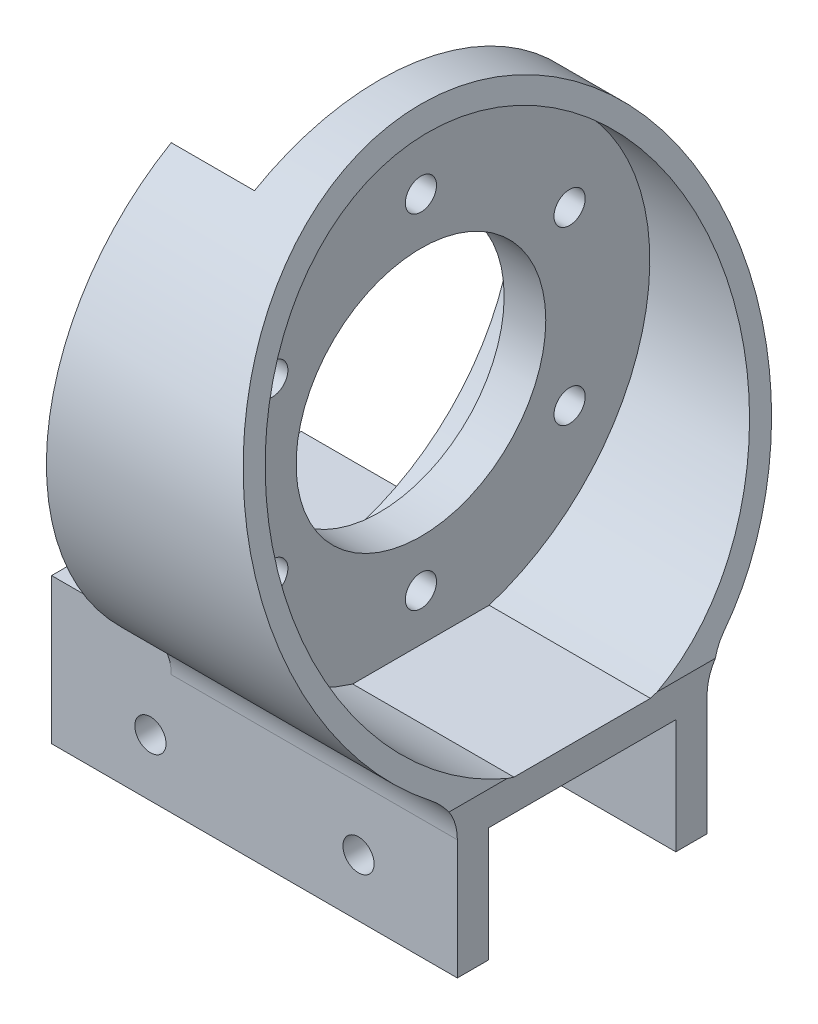
ISO-10303-21;
HEADER;
FILE_DESCRIPTION(('STEP AP214'),'2;1');
FILE_NAME('part.step','',(''),(''),'','','');
FILE_SCHEMA(('AUTOMOTIVE_DESIGN { 1 0 10303 214 1 1 1 1 }'));
ENDSEC;
DATA;
#1=APPLICATION_CONTEXT('core data for automotive mechanical design processes');
#2=APPLICATION_PROTOCOL_DEFINITION('international standard','automotive_design',2000,#1);
#3=PRODUCT_CONTEXT('',#1,'mechanical');
#4=PRODUCT('Part','Part','',(#3));
#5=PRODUCT_RELATED_PRODUCT_CATEGORY('part','',(#4));
#6=PRODUCT_DEFINITION_FORMATION('','',#4);
#7=PRODUCT_DEFINITION_CONTEXT('part definition',#1,'design');
#8=PRODUCT_DEFINITION('design','',#6,#7);
#9=PRODUCT_DEFINITION_SHAPE('','',#8);
#10=(LENGTH_UNIT() NAMED_UNIT(*) SI_UNIT(.MILLI.,.METRE.));
#11=(NAMED_UNIT(*) PLANE_ANGLE_UNIT() SI_UNIT($,.RADIAN.));
#12=(NAMED_UNIT(*) SI_UNIT($,.STERADIAN.) SOLID_ANGLE_UNIT());
#13=UNCERTAINTY_MEASURE_WITH_UNIT(LENGTH_MEASURE(1.E-05),#10,'distance_accuracy_value','');
#14=(GEOMETRIC_REPRESENTATION_CONTEXT(3) GLOBAL_UNCERTAINTY_ASSIGNED_CONTEXT((#13)) GLOBAL_UNIT_ASSIGNED_CONTEXT((#10,
#11,#12)) REPRESENTATION_CONTEXT('',''));
#15=CARTESIAN_POINT('',(0.,0.,0.));
#16=DIRECTION('',(0.,0.,1.));
#17=DIRECTION('',(1.,0.,0.));
#18=AXIS2_PLACEMENT_3D('',#15,#16,#17);
#19=CARTESIAN_POINT('',(16.5,-11.9946802489416,27.));
#20=DIRECTION('',(-1.,0.,0.));
#21=DIRECTION('',(0.,0.,1.));
#22=AXIS2_PLACEMENT_3D('',#19,#20,#21);
#23=CYLINDRICAL_SURFACE('',#22,5.);
#24=CARTESIAN_POINT('',(4.50000000000001,-11.9946802489416,27.));
#25=DIRECTION('',(-1.,0.,0.));
#26=DIRECTION('',(0.,0.,1.));
#27=AXIS2_PLACEMENT_3D('',#24,#25,#26);
#28=CIRCLE('',#27,5.);
#29=CARTESIAN_POINT('',(4.50000000000001,-11.9946802489416,22.));
#30=VERTEX_POINT('',#29);
#31=CARTESIAN_POINT('',(4.50000000000001,-7.94387330946891,24.0689655172414));
#32=VERTEX_POINT('',#31);
#33=EDGE_CURVE('E53',#30,#32,#28,.F.);
#34=ORIENTED_EDGE('',*,*,#33,.F.);
#35=DIRECTION('',(1.,0.,0.));
#36=VECTOR('',#35,1.);
#37=CARTESIAN_POINT('',(4.5,-11.9946802489416,22.));
#38=LINE('',#37,#36);
#39=CARTESIAN_POINT('',(32.,-11.9946802489416,22.));
#40=VERTEX_POINT('',#39);
#41=EDGE_CURVE('E224',#40,#30,#38,.F.);
#42=ORIENTED_EDGE('',*,*,#41,.F.);
#43=CARTESIAN_POINT('',(32.,-11.9946802489416,27.));
#44=DIRECTION('',(1.,0.,0.));
#45=DIRECTION('',(0.,0.,-1.));
#46=AXIS2_PLACEMENT_3D('',#43,#44,#45);
#47=CIRCLE('',#46,5.);
#48=CARTESIAN_POINT('',(32.,-9.28460969082664,22.7981530763201));
#49=VERTEX_POINT('',#48);
#50=EDGE_CURVE('E231',#49,#40,#47,.F.);
#51=ORIENTED_EDGE('',*,*,#50,.F.);
#52=CARTESIAN_POINT('',(32.9379582392428,-11.9946802489416,27.));
#53=DIRECTION('',(-0.945001497744751,-0.327066001382254,0.));
#54=DIRECTION('',(-0.327066001382254,0.945001497744752,0.));
#55=AXIS2_PLACEMENT_3D('',#52,#53,#54);
#56=ELLIPSE('',#55,5.2909969052245,5.);
#57=CARTESIAN_POINT('',(31.5359697437466,-7.94387330946891,24.0689655172414));
#58=VERTEX_POINT('',#57);
#59=EDGE_CURVE('E228',#58,#49,#56,.T.);
#60=ORIENTED_EDGE('',*,*,#59,.F.);
#61=DIRECTION('',(-1.,0.,0.));
#62=VECTOR('',#61,1.);
#63=CARTESIAN_POINT('',(16.5,-7.94387330946891,24.0689655172414));
#64=LINE('',#63,#62);
#65=EDGE_CURVE('E221',#32,#58,#64,.F.);
#66=ORIENTED_EDGE('',*,*,#65,.F.);
#67=EDGE_LOOP('',(#34,#42,#51,#60,#66));
#68=FACE_BOUND('',#67,.T.);
#69=ADVANCED_FACE('F36',(#68),#23,.F.);
#70=CARTESIAN_POINT('',(16.5,-11.9946802489416,-6.99999999999996));
#71=DIRECTION('',(-1.,0.,0.));
#72=DIRECTION('',(0.,0.,1.));
#73=AXIS2_PLACEMENT_3D('',#70,#71,#72);
#74=CYLINDRICAL_SURFACE('',#73,5.);
#75=DIRECTION('',(1.,0.,0.));
#76=VECTOR('',#75,1.);
#77=CARTESIAN_POINT('',(32.,-11.9946802489416,-1.99999999999996));
#78=LINE('',#77,#76);
#79=CARTESIAN_POINT('',(4.50000000000001,-11.9946802489416,-1.99999999999996));
#80=VERTEX_POINT('',#79);
#81=CARTESIAN_POINT('',(32.,-11.9946802489416,-1.99999999999996));
#82=VERTEX_POINT('',#81);
#83=EDGE_CURVE('E226',#80,#82,#78,.T.);
#84=ORIENTED_EDGE('',*,*,#83,.F.);
#85=CARTESIAN_POINT('',(4.50000000000001,-11.9946802489416,-6.99999999999996));
#86=DIRECTION('',(-1.,0.,0.));
#87=DIRECTION('',(0.,0.,1.));
#88=AXIS2_PLACEMENT_3D('',#85,#86,#87);
#89=CIRCLE('',#88,5.);
#90=CARTESIAN_POINT('',(4.50000000000001,-7.94387330946885,-4.06896551724129));
#91=VERTEX_POINT('',#90);
#92=EDGE_CURVE('E234',#91,#80,#89,.F.);
#93=ORIENTED_EDGE('',*,*,#92,.F.);
#94=DIRECTION('',(-1.,0.,0.));
#95=VECTOR('',#94,1.);
#96=CARTESIAN_POINT('',(16.5,-7.94387330946895,-4.06896551724136));
#97=LINE('',#96,#95);
#98=CARTESIAN_POINT('',(31.5359697437466,-7.94387330946895,-4.06896551724136));
#99=VERTEX_POINT('',#98);
#100=EDGE_CURVE('E218',#99,#91,#97,.T.);
#101=ORIENTED_EDGE('',*,*,#100,.F.);
#102=CARTESIAN_POINT('',(32.9379582392428,-11.9946802489416,-6.99999999999996));
#103=DIRECTION('',(-0.945001497744751,-0.327066001382254,0.));
#104=DIRECTION('',(-0.327066001382254,0.945001497744752,0.));
#105=AXIS2_PLACEMENT_3D('',#102,#103,#104);
#106=ELLIPSE('',#105,5.2909969052245,5.);
#107=CARTESIAN_POINT('',(32.,-9.28460969082664,-2.79815307632004));
#108=VERTEX_POINT('',#107);
#109=EDGE_CURVE('E11',#108,#99,#106,.T.);
#110=ORIENTED_EDGE('',*,*,#109,.F.);
#111=CARTESIAN_POINT('',(32.,-11.9946802489416,-6.99999999999996));
#112=DIRECTION('',(1.,0.,0.));
#113=DIRECTION('',(0.,0.,-1.));
#114=AXIS2_PLACEMENT_3D('',#111,#112,#113);
#115=CIRCLE('',#114,5.);
#116=EDGE_CURVE('E45',#82,#108,#115,.F.);
#117=ORIENTED_EDGE('',*,*,#116,.F.);
#118=EDGE_LOOP('',(#84,#93,#101,#110,#117));
#119=FACE_BOUND('',#118,.T.);
#120=ADVANCED_FACE('F38',(#119),#74,.F.);
#121=CARTESIAN_POINT('',(16.5,11.5,10.));
#122=DIRECTION('',(-1.,0.,0.));
#123=DIRECTION('',(0.,0.,1.));
#124=AXIS2_PLACEMENT_3D('',#121,#122,#123);
#125=CYLINDRICAL_SURFACE('',#124,24.0000000000001);
#126=CARTESIAN_POINT('',(4.50000000000001,11.5,10.));
#127=DIRECTION('',(-1.,0.,0.));
#128=DIRECTION('',(0.,0.,1.));
#129=AXIS2_PLACEMENT_3D('',#126,#127,#128);
#130=CIRCLE('',#129,24.0000000000001);
#131=CARTESIAN_POINT('',(4.50000000000001,32.2846096908267,22.0000000000001));
#132=VERTEX_POINT('',#131);
#133=EDGE_CURVE('E336',#32,#132,#130,.T.);
#134=ORIENTED_EDGE('',*,*,#133,.F.);
#135=ORIENTED_EDGE('',*,*,#65,.T.);
#136=CARTESIAN_POINT('',(24.8064249653648,11.5,10.));
#137=DIRECTION('',(-0.945001497744751,-0.327066001382254,0.));
#138=DIRECTION('',(-0.327066001382254,0.945001497744752,0.));
#139=AXIS2_PLACEMENT_3D('',#136,#137,#138);
#140=ELLIPSE('',#139,25.3967851450777,24.0000000000001);
#141=EDGE_CURVE('E267',#99,#58,#140,.F.);
#142=ORIENTED_EDGE('',*,*,#141,.F.);
#143=ORIENTED_EDGE('',*,*,#100,.T.);
#144=CARTESIAN_POINT('',(4.50000000000001,11.5,10.));
#145=DIRECTION('',(-1.,0.,0.));
#146=DIRECTION('',(0.,0.,1.));
#147=AXIS2_PLACEMENT_3D('',#144,#145,#146);
#148=CIRCLE('',#147,24.);
#149=CARTESIAN_POINT('',(4.50000000000001,11.4999999999998,-14.));
#150=VERTEX_POINT('',#149);
#151=EDGE_CURVE('E348',#150,#91,#148,.T.);
#152=ORIENTED_EDGE('',*,*,#151,.F.);
#153=DIRECTION('',(-1.,0.,0.));
#154=VECTOR('',#153,1.);
#155=CARTESIAN_POINT('',(16.5,11.4999999999998,-14.));
#156=LINE('',#155,#154);
#157=CARTESIAN_POINT('',(12.5,11.4999999999998,-14.));
#158=VERTEX_POINT('',#157);
#159=EDGE_CURVE('E356',#158,#150,#156,.T.);
#160=ORIENTED_EDGE('',*,*,#159,.F.);
#161=CARTESIAN_POINT('',(12.5,11.5,10.));
#162=DIRECTION('',(-1.,0.,0.));
#163=DIRECTION('',(0.,0.,1.));
#164=AXIS2_PLACEMENT_3D('',#161,#162,#163);
#165=CIRCLE('',#164,24.0000000000001);
#166=CARTESIAN_POINT('',(12.5,32.2846096908267,22.0000000000001));
#167=VERTEX_POINT('',#166);
#168=EDGE_CURVE('E324',#167,#158,#165,.T.);
#169=ORIENTED_EDGE('',*,*,#168,.F.);
#170=DIRECTION('',(-1.,0.,0.));
#171=VECTOR('',#170,1.);
#172=CARTESIAN_POINT('',(16.5,32.2846096908267,22.0000000000001));
#173=LINE('',#172,#171);
#174=EDGE_CURVE('E358',#167,#132,#173,.T.);
#175=ORIENTED_EDGE('',*,*,#174,.T.);
#176=EDGE_LOOP('',(#134,#135,#142,#143,#152,#160,#169,#175));
#177=FACE_BOUND('',#176,.T.);
#178=ADVANCED_FACE('F425',(#177),#125,.T.);
#179=CARTESIAN_POINT('',(16.5,0.,0.));
#180=DIRECTION('',(1.,0.,0.));
#181=DIRECTION('',(0.,0.,-1.));
#182=AXIS2_PLACEMENT_3D('',#179,#180,#181);
#183=PLANE('',#182);
#184=CARTESIAN_POINT('',(16.5,19.7499999999998,24.2894191624429));
#185=DIRECTION('',(1.,0.,0.));
#186=DIRECTION('',(0.,0.,-1.));
#187=AXIS2_PLACEMENT_3D('',#184,#185,#186);
#188=CIRCLE('',#187,1.5);
#189=CARTESIAN_POINT('',(16.5,19.7499999999998,22.7894191624429));
#190=VERTEX_POINT('',#189);
#191=EDGE_CURVE('E362',#190,#190,#188,.T.);
#192=ORIENTED_EDGE('',*,*,#191,.F.);
#193=EDGE_LOOP('',(#192));
#194=FACE_BOUND('',#193,.T.);
#195=CARTESIAN_POINT('',(16.5,-5.,9.99999999999941));
#196=DIRECTION('',(1.,0.,0.));
#197=DIRECTION('',(0.,0.,-1.));
#198=AXIS2_PLACEMENT_3D('',#195,#196,#197);
#199=CIRCLE('',#198,1.5);
#200=CARTESIAN_POINT('',(16.5,-5.,8.49999999999941));
#201=VERTEX_POINT('',#200);
#202=EDGE_CURVE('E374',#201,#201,#199,.T.);
#203=ORIENTED_EDGE('',*,*,#202,.F.);
#204=EDGE_LOOP('',(#203));
#205=FACE_BOUND('',#204,.T.);
#206=CARTESIAN_POINT('',(16.5,19.7500000000002,-4.28941916244361));
#207=DIRECTION('',(1.,0.,0.));
#208=DIRECTION('',(0.,0.,-1.));
#209=AXIS2_PLACEMENT_3D('',#206,#207,#208);
#210=CIRCLE('',#209,1.5);
#211=CARTESIAN_POINT('',(16.5,19.7500000000002,-5.78941916244361));
#212=VERTEX_POINT('',#211);
#213=EDGE_CURVE('E386',#212,#212,#210,.T.);
#214=ORIENTED_EDGE('',*,*,#213,.F.);
#215=EDGE_LOOP('',(#214));
#216=FACE_BOUND('',#215,.T.);
#217=CARTESIAN_POINT('',(16.5,11.5,10.));
#218=DIRECTION('',(1.,0.,0.));
#219=DIRECTION('',(0.,0.,-1.));
#220=AXIS2_PLACEMENT_3D('',#217,#218,#219);
#221=CIRCLE('',#220,12.);
#222=CARTESIAN_POINT('',(16.5,11.5,-2.));
#223=VERTEX_POINT('',#222);
#224=EDGE_CURVE('E398',#223,#223,#221,.T.);
#225=ORIENTED_EDGE('',*,*,#224,.F.);
#226=EDGE_LOOP('',(#225));
#227=FACE_BOUND('',#226,.T.);
#228=CARTESIAN_POINT('',(16.5,28.,10.));
#229=DIRECTION('',(1.,0.,0.));
#230=DIRECTION('',(0.,0.,-1.));
#231=AXIS2_PLACEMENT_3D('',#228,#229,#230);
#232=CIRCLE('',#231,1.5);
#233=CARTESIAN_POINT('',(16.5,28.,8.5));
#234=VERTEX_POINT('',#233);
#235=EDGE_CURVE('E392',#234,#234,#232,.T.);
#236=ORIENTED_EDGE('',*,*,#235,.F.);
#237=EDGE_LOOP('',(#236));
#238=FACE_BOUND('',#237,.T.);
#239=CARTESIAN_POINT('',(16.5,3.25000000000014,-4.28941916244379));
#240=DIRECTION('',(1.,0.,0.));
#241=DIRECTION('',(0.,0.,-1.));
#242=AXIS2_PLACEMENT_3D('',#239,#240,#241);
#243=CIRCLE('',#242,1.5);
#244=CARTESIAN_POINT('',(16.5,3.25000000000014,-5.78941916244379));
#245=VERTEX_POINT('',#244);
#246=EDGE_CURVE('E380',#245,#245,#243,.T.);
#247=ORIENTED_EDGE('',*,*,#246,.F.);
#248=EDGE_LOOP('',(#247));
#249=FACE_BOUND('',#248,.T.);
#250=CARTESIAN_POINT('',(16.5,3.24999999999973,24.2894191624426));
#251=DIRECTION('',(1.,0.,0.));
#252=DIRECTION('',(0.,0.,-1.));
#253=AXIS2_PLACEMENT_3D('',#250,#251,#252);
#254=CIRCLE('',#253,1.5);
#255=CARTESIAN_POINT('',(16.5,3.24999999999973,22.7894191624426));
#256=VERTEX_POINT('',#255);
#257=EDGE_CURVE('E368',#256,#256,#254,.T.);
#258=ORIENTED_EDGE('',*,*,#257,.F.);
#259=EDGE_LOOP('',(#258));
#260=FACE_BOUND('',#259,.T.);
#261=CARTESIAN_POINT('',(16.5,11.5,10.));
#262=DIRECTION('',(1.,0.,0.));
#263=DIRECTION('',(0.,0.,-1.));
#264=AXIS2_PLACEMENT_3D('',#261,#262,#263);
#265=CIRCLE('',#264,22.);
#266=CARTESIAN_POINT('',(16.5,-9.5,3.44256147569801));
#267=VERTEX_POINT('',#266);
#268=CARTESIAN_POINT('',(16.5,-9.5,16.557438524302));
#269=VERTEX_POINT('',#268);
#270=EDGE_CURVE('E271',#267,#269,#265,.T.);
#271=ORIENTED_EDGE('',*,*,#270,.T.);
#272=DIRECTION('',(0.,0.,-1.));
#273=VECTOR('',#272,1.);
#274=CARTESIAN_POINT('',(16.5,-9.5,25.));
#275=LINE('',#274,#273);
#276=EDGE_CURVE('E213',#269,#267,#275,.T.);
#277=ORIENTED_EDGE('',*,*,#276,.T.);
#278=EDGE_LOOP('',(#271,#277));
#279=FACE_BOUND('',#278,.T.);
#280=ADVANCED_FACE('F404',(#194,#205,#216,#227,#238,#249,#260,#279),#183,.T.);
#281=CARTESIAN_POINT('',(-12.,-9.5,0.));
#282=DIRECTION('',(0.,-1.,0.));
#283=DIRECTION('',(0.,0.,-1.));
#284=AXIS2_PLACEMENT_3D('',#281,#282,#283);
#285=PLANE('',#284);
#286=DIRECTION('',(0.,0.,-1.));
#287=VECTOR('',#286,1.);
#288=CARTESIAN_POINT('',(-6.99999999999999,-9.5,0.));
#289=LINE('',#288,#287);
#290=CARTESIAN_POINT('',(-6.99999999999999,-9.5,22.));
#291=VERTEX_POINT('',#290);
#292=CARTESIAN_POINT('',(-6.99999999999999,-9.5,-1.99999999999997));
#293=VERTEX_POINT('',#292);
#294=EDGE_CURVE('E183',#291,#293,#289,.T.);
#295=ORIENTED_EDGE('',*,*,#294,.F.);
#296=DIRECTION('',(-1.,0.,0.));
#297=VECTOR('',#296,1.);
#298=CARTESIAN_POINT('',(7.08225865342324,-9.5,22.));
#299=LINE('',#298,#297);
#300=CARTESIAN_POINT('',(4.50000000000001,-9.5,22.));
#301=VERTEX_POINT('',#300);
#302=EDGE_CURVE('E192',#301,#291,#299,.T.);
#303=ORIENTED_EDGE('',*,*,#302,.F.);
#304=DIRECTION('',(0.,0.,1.));
#305=VECTOR('',#304,1.);
#306=CARTESIAN_POINT('',(4.50000000000001,-9.5,0.));
#307=LINE('',#306,#305);
#308=CARTESIAN_POINT('',(4.50000000000001,-9.5,10.));
#309=VERTEX_POINT('',#308);
#310=EDGE_CURVE('E335',#309,#301,#307,.T.);
#311=ORIENTED_EDGE('',*,*,#310,.F.);
#312=DIRECTION('',(0.,0.,1.));
#313=VECTOR('',#312,1.);
#314=CARTESIAN_POINT('',(4.50000000000001,-9.5,0.));
#315=LINE('',#314,#313);
#316=CARTESIAN_POINT('',(4.50000000000001,-9.5,-1.99999999999997));
#317=VERTEX_POINT('',#316);
#318=EDGE_CURVE('E351',#317,#309,#315,.T.);
#319=ORIENTED_EDGE('',*,*,#318,.F.);
#320=DIRECTION('',(-1.,0.,0.));
#321=VECTOR('',#320,1.);
#322=CARTESIAN_POINT('',(7.08225865342324,-9.5,-1.99999999999997));
#323=LINE('',#322,#321);
#324=EDGE_CURVE('E206',#317,#293,#323,.T.);
#325=ORIENTED_EDGE('',*,*,#324,.T.);
#326=EDGE_LOOP('',(#295,#303,#311,#319,#325));
#327=FACE_BOUND('',#326,.T.);
#328=ADVANCED_FACE('F203',(#327),#285,.F.);
#329=ORIENTED_EDGE('',*,*,#276,.F.);
#330=DIRECTION('',(-1.,0.,0.));
#331=VECTOR('',#330,1.);
#332=CARTESIAN_POINT('',(99.8822509939089,-9.5,16.557438524302));
#333=LINE('',#332,#331);
#334=CARTESIAN_POINT('',(32.,-9.5,16.557438524302));
#335=VERTEX_POINT('',#334);
#336=EDGE_CURVE('E279',#269,#335,#333,.F.);
#337=ORIENTED_EDGE('',*,*,#336,.T.);
#338=DIRECTION('',(0.,0.,1.));
#339=VECTOR('',#338,1.);
#340=CARTESIAN_POINT('',(32.,-9.5,-34.));
#341=LINE('',#340,#339);
#342=CARTESIAN_POINT('',(32.,-9.5,3.44256147569801));
#343=VERTEX_POINT('',#342);
#344=EDGE_CURVE('E208',#343,#335,#341,.T.);
#345=ORIENTED_EDGE('',*,*,#344,.F.);
#346=DIRECTION('',(-1.,0.,0.));
#347=VECTOR('',#346,1.);
#348=CARTESIAN_POINT('',(99.8822509939089,-9.5,3.44256147569801));
#349=LINE('',#348,#347);
#350=EDGE_CURVE('E273',#343,#267,#349,.T.);
#351=ORIENTED_EDGE('',*,*,#350,.T.);
#352=EDGE_LOOP('',(#329,#337,#345,#351));
#353=FACE_BOUND('',#352,.T.);
#354=ADVANCED_FACE('F409',(#353),#285,.F.);
#355=CARTESIAN_POINT('',(32.,0.,0.));
#356=DIRECTION('',(1.,0.,0.));
#357=DIRECTION('',(0.,0.,-1.));
#358=AXIS2_PLACEMENT_3D('',#355,#356,#357);
#359=PLANE('',#358);
#360=DIRECTION('',(0.,0.,1.));
#361=VECTOR('',#360,1.);
#362=CARTESIAN_POINT('',(32.,-9.28460969082664,-52.));
#363=LINE('',#362,#361);
#364=CARTESIAN_POINT('',(32.,-9.28460969082664,17.2111025509276));
#365=VERTEX_POINT('',#364);
#366=EDGE_CURVE('E262',#365,#49,#363,.T.);
#367=ORIENTED_EDGE('',*,*,#366,.T.);
#368=ORIENTED_EDGE('',*,*,#50,.T.);
#369=DIRECTION('',(0.,1.,0.));
#370=VECTOR('',#369,1.);
#371=CARTESIAN_POINT('',(32.,-37.5,22.));
#372=LINE('',#371,#370);
#373=CARTESIAN_POINT('',(32.,-23.5000000000001,22.));
#374=VERTEX_POINT('',#373);
#375=EDGE_CURVE('E310',#374,#40,#372,.T.);
#376=ORIENTED_EDGE('',*,*,#375,.F.);
#377=DIRECTION('',(0.,0.,-1.));
#378=VECTOR('',#377,1.);
#379=CARTESIAN_POINT('',(32.,-23.5000000000001,33.));
#380=LINE('',#379,#378);
#381=CARTESIAN_POINT('',(32.,-23.5000000000001,19.));
#382=VERTEX_POINT('',#381);
#383=EDGE_CURVE('E289',#374,#382,#380,.T.);
#384=ORIENTED_EDGE('',*,*,#383,.T.);
#385=DIRECTION('',(0.,-1.,0.));
#386=VECTOR('',#385,1.);
#387=CARTESIAN_POINT('',(32.,-37.5,19.));
#388=LINE('',#387,#386);
#389=CARTESIAN_POINT('',(32.,-12.5,19.));
#390=VERTEX_POINT('',#389);
#391=EDGE_CURVE('E312',#390,#382,#388,.T.);
#392=ORIENTED_EDGE('',*,*,#391,.F.);
#393=DIRECTION('',(0.,0.,1.));
#394=VECTOR('',#393,1.);
#395=CARTESIAN_POINT('',(32.,-12.5,10.));
#396=LINE('',#395,#394);
#397=CARTESIAN_POINT('',(32.,-12.5,1.));
#398=VERTEX_POINT('',#397);
#399=EDGE_CURVE('E299',#398,#390,#396,.T.);
#400=ORIENTED_EDGE('',*,*,#399,.F.);
#401=DIRECTION('',(0.,1.,0.));
#402=VECTOR('',#401,1.);
#403=CARTESIAN_POINT('',(32.,-37.5,1.));
#404=LINE('',#403,#402);
#405=CARTESIAN_POINT('',(32.,-23.5,1.));
#406=VERTEX_POINT('',#405);
#407=EDGE_CURVE('E305',#406,#398,#404,.T.);
#408=ORIENTED_EDGE('',*,*,#407,.F.);
#409=CARTESIAN_POINT('',(32.,-23.5,-1.99999999999997));
#410=VERTEX_POINT('',#409);
#411=EDGE_CURVE('E286',#406,#410,#380,.T.);
#412=ORIENTED_EDGE('',*,*,#411,.T.);
#413=DIRECTION('',(0.,-1.,0.));
#414=VECTOR('',#413,1.);
#415=CARTESIAN_POINT('',(32.,-37.5,-1.99999999999997));
#416=LINE('',#415,#414);
#417=EDGE_CURVE('E308',#82,#410,#416,.T.);
#418=ORIENTED_EDGE('',*,*,#417,.F.);
#419=ORIENTED_EDGE('',*,*,#116,.T.);
#420=CARTESIAN_POINT('',(32.,-9.28460969082664,2.78889744907236));
#421=VERTEX_POINT('',#420);
#422=EDGE_CURVE('E60',#108,#421,#363,.T.);
#423=ORIENTED_EDGE('',*,*,#422,.T.);
#424=CARTESIAN_POINT('',(32.,11.5,10.));
#425=DIRECTION('',(1.,0.,0.));
#426=DIRECTION('',(0.,0.,-1.));
#427=AXIS2_PLACEMENT_3D('',#424,#425,#426);
#428=CIRCLE('',#427,22.);
#429=EDGE_CURVE('E274',#343,#421,#428,.T.);
#430=ORIENTED_EDGE('',*,*,#429,.F.);
#431=ORIENTED_EDGE('',*,*,#344,.T.);
#432=EDGE_CURVE('E270',#365,#335,#428,.T.);
#433=ORIENTED_EDGE('',*,*,#432,.F.);
#434=EDGE_LOOP('',(#367,#368,#376,#384,#392,#400,#408,#412,#418,#419,#423,#430,#431,#433));
#435=FACE_BOUND('',#434,.T.);
#436=ADVANCED_FACE('F416',(#435),#359,.T.);
#437=CARTESIAN_POINT('',(-6.99999999999999,0.,0.));
#438=DIRECTION('',(-1.,0.,0.));
#439=DIRECTION('',(0.,0.,1.));
#440=AXIS2_PLACEMENT_3D('',#437,#438,#439);
#441=PLANE('',#440);
#442=DIRECTION('',(0.,1.,0.));
#443=VECTOR('',#442,1.);
#444=CARTESIAN_POINT('',(-6.99999999999999,-37.5,22.));
#445=LINE('',#444,#443);
#446=CARTESIAN_POINT('',(-6.99999999999999,-23.5000000000001,22.));
#447=VERTEX_POINT('',#446);
#448=EDGE_CURVE('E179',#447,#291,#445,.T.);
#449=ORIENTED_EDGE('',*,*,#448,.T.);
#450=ORIENTED_EDGE('',*,*,#294,.T.);
#451=DIRECTION('',(0.,-1.,0.));
#452=VECTOR('',#451,1.);
#453=CARTESIAN_POINT('',(-6.99999999999999,-37.5,-1.99999999999997));
#454=LINE('',#453,#452);
#455=CARTESIAN_POINT('',(-6.99999999999999,-23.5,-1.99999999999997));
#456=VERTEX_POINT('',#455);
#457=EDGE_CURVE('E188',#293,#456,#454,.T.);
#458=ORIENTED_EDGE('',*,*,#457,.T.);
#459=DIRECTION('',(0.,0.,-1.));
#460=VECTOR('',#459,1.);
#461=CARTESIAN_POINT('',(-6.99999999999999,-23.5000000000001,33.));
#462=LINE('',#461,#460);
#463=CARTESIAN_POINT('',(-6.99999999999999,-23.5,1.));
#464=VERTEX_POINT('',#463);
#465=EDGE_CURVE('E285',#464,#456,#462,.T.);
#466=ORIENTED_EDGE('',*,*,#465,.F.);
#467=DIRECTION('',(0.,1.,0.));
#468=VECTOR('',#467,1.);
#469=CARTESIAN_POINT('',(-6.99999999999999,-37.5,1.));
#470=LINE('',#469,#468);
#471=CARTESIAN_POINT('',(-6.99999999999999,-12.5,1.));
#472=VERTEX_POINT('',#471);
#473=EDGE_CURVE('E296',#464,#472,#470,.T.);
#474=ORIENTED_EDGE('',*,*,#473,.T.);
#475=DIRECTION('',(0.,0.,1.));
#476=VECTOR('',#475,1.);
#477=CARTESIAN_POINT('',(-6.99999999999999,-12.5,10.));
#478=LINE('',#477,#476);
#479=CARTESIAN_POINT('',(-6.99999999999999,-12.5,19.));
#480=VERTEX_POINT('',#479);
#481=EDGE_CURVE('E298',#472,#480,#478,.T.);
#482=ORIENTED_EDGE('',*,*,#481,.T.);
#483=DIRECTION('',(0.,-1.,0.));
#484=VECTOR('',#483,1.);
#485=CARTESIAN_POINT('',(-6.99999999999999,-37.5,19.));
#486=LINE('',#485,#484);
#487=CARTESIAN_POINT('',(-6.99999999999999,-23.5000000000001,19.));
#488=VERTEX_POINT('',#487);
#489=EDGE_CURVE('E189',#480,#488,#486,.T.);
#490=ORIENTED_EDGE('',*,*,#489,.T.);
#491=EDGE_CURVE('E185',#447,#488,#462,.T.);
#492=ORIENTED_EDGE('',*,*,#491,.F.);
#493=EDGE_LOOP('',(#449,#450,#458,#466,#474,#482,#490,#492));
#494=FACE_BOUND('',#493,.T.);
#495=ADVANCED_FACE('F181',(#494),#441,.T.);
#496=CARTESIAN_POINT('',(4.50000000000001,0.,0.));
#497=DIRECTION('',(-1.,0.,0.));
#498=DIRECTION('',(0.,0.,1.));
#499=AXIS2_PLACEMENT_3D('',#496,#497,#498);
#500=PLANE('',#499);
#501=ORIENTED_EDGE('',*,*,#151,.T.);
#502=ORIENTED_EDGE('',*,*,#92,.T.);
#503=DIRECTION('',(0.,-1.,0.));
#504=VECTOR('',#503,1.);
#505=CARTESIAN_POINT('',(4.50000000000001,-11.9946802489416,-1.99999999999996));
#506=LINE('',#505,#504);
#507=EDGE_CURVE('E200',#317,#80,#506,.T.);
#508=ORIENTED_EDGE('',*,*,#507,.F.);
#509=ORIENTED_EDGE('',*,*,#318,.T.);
#510=CARTESIAN_POINT('',(4.50000000000001,11.5,10.));
#511=DIRECTION('',(-1.,0.,0.));
#512=DIRECTION('',(0.,0.,1.));
#513=AXIS2_PLACEMENT_3D('',#510,#511,#512);
#514=CIRCLE('',#513,21.0000000000014);
#515=CARTESIAN_POINT('',(4.50000000000001,11.4999999999999,-11.));
#516=VERTEX_POINT('',#515);
#517=EDGE_CURVE('E342',#516,#309,#514,.T.);
#518=ORIENTED_EDGE('',*,*,#517,.F.);
#519=DIRECTION('',(0.,0.,-1.));
#520=VECTOR('',#519,1.);
#521=CARTESIAN_POINT('',(4.50000000000001,11.4999999999999,0.));
#522=LINE('',#521,#520);
#523=EDGE_CURVE('E345',#516,#150,#522,.T.);
#524=ORIENTED_EDGE('',*,*,#523,.T.);
#525=EDGE_LOOP('',(#501,#502,#508,#509,#518,#524));
#526=FACE_BOUND('',#525,.T.);
#527=ADVANCED_FACE('F434',(#526),#500,.T.);
#528=CARTESIAN_POINT('',(4.50000000000001,0.,0.));
#529=DIRECTION('',(-1.,0.,0.));
#530=DIRECTION('',(0.,0.,1.));
#531=AXIS2_PLACEMENT_3D('',#528,#529,#530);
#532=PLANE('',#531);
#533=ORIENTED_EDGE('',*,*,#310,.T.);
#534=DIRECTION('',(0.,1.,0.));
#535=VECTOR('',#534,1.);
#536=CARTESIAN_POINT('',(4.50000000000001,-11.9946802489416,22.));
#537=LINE('',#536,#535);
#538=EDGE_CURVE('E196',#30,#301,#537,.T.);
#539=ORIENTED_EDGE('',*,*,#538,.F.);
#540=ORIENTED_EDGE('',*,*,#33,.T.);
#541=ORIENTED_EDGE('',*,*,#133,.T.);
#542=DIRECTION('',(0.,0.866025403784438,0.500000000000001));
#543=VECTOR('',#542,1.);
#544=CARTESIAN_POINT('',(4.50000000000001,-1.45512701892219,2.52035392823946));
#545=LINE('',#544,#543);
#546=CARTESIAN_POINT('',(4.50000000000001,29.6865334794732,20.5));
#547=VERTEX_POINT('',#546);
#548=EDGE_CURVE('E332',#547,#132,#545,.T.);
#549=ORIENTED_EDGE('',*,*,#548,.F.);
#550=CARTESIAN_POINT('',(4.50000000000001,11.5,10.));
#551=DIRECTION('',(-1.,0.,0.));
#552=DIRECTION('',(0.,0.,1.));
#553=AXIS2_PLACEMENT_3D('',#550,#551,#552);
#554=CIRCLE('',#553,21.0000000000014);
#555=EDGE_CURVE('E323',#309,#547,#554,.T.);
#556=ORIENTED_EDGE('',*,*,#555,.F.);
#557=EDGE_LOOP('',(#533,#539,#540,#541,#549,#556));
#558=FACE_BOUND('',#557,.T.);
#559=ADVANCED_FACE('F442',(#558),#532,.T.);
#560=CARTESIAN_POINT('',(12.5,0.,0.));
#561=DIRECTION('',(1.,0.,0.));
#562=DIRECTION('',(0.,0.,-1.));
#563=AXIS2_PLACEMENT_3D('',#560,#561,#562);
#564=PLANE('',#563);
#565=CARTESIAN_POINT('',(12.5,11.5,10.));
#566=DIRECTION('',(-1.,0.,0.));
#567=DIRECTION('',(0.,0.,1.));
#568=AXIS2_PLACEMENT_3D('',#565,#566,#567);
#569=CIRCLE('',#568,21.0000000000014);
#570=CARTESIAN_POINT('',(12.5,11.4999999999999,-11.));
#571=VERTEX_POINT('',#570);
#572=CARTESIAN_POINT('',(12.5,29.6865334794732,20.5));
#573=VERTEX_POINT('',#572);
#574=EDGE_CURVE('E338',#571,#573,#569,.T.);
#575=ORIENTED_EDGE('',*,*,#574,.T.);
#576=DIRECTION('',(0.,0.866025403784438,0.500000000000001));
#577=VECTOR('',#576,1.);
#578=CARTESIAN_POINT('',(12.5,29.6865334794732,20.5));
#579=LINE('',#578,#577);
#580=EDGE_CURVE('E317',#573,#167,#579,.T.);
#581=ORIENTED_EDGE('',*,*,#580,.T.);
#582=ORIENTED_EDGE('',*,*,#168,.T.);
#583=DIRECTION('',(0.,0.,1.));
#584=VECTOR('',#583,1.);
#585=CARTESIAN_POINT('',(12.5,11.4999999999999,-11.));
#586=LINE('',#585,#584);
#587=EDGE_CURVE('E320',#158,#571,#586,.T.);
#588=ORIENTED_EDGE('',*,*,#587,.T.);
#589=EDGE_LOOP('',(#575,#581,#582,#588));
#590=FACE_BOUND('',#589,.T.);
#591=CARTESIAN_POINT('',(12.5,11.5,10.));
#592=DIRECTION('',(1.,0.,0.));
#593=DIRECTION('',(0.,0.,-1.));
#594=AXIS2_PLACEMENT_3D('',#591,#592,#593);
#595=CIRCLE('',#594,12.);
#596=CARTESIAN_POINT('',(12.5,11.5,-2.));
#597=VERTEX_POINT('',#596);
#598=EDGE_CURVE('E395',#597,#597,#595,.T.);
#599=ORIENTED_EDGE('',*,*,#598,.T.);
#600=EDGE_LOOP('',(#599));
#601=FACE_BOUND('',#600,.T.);
#602=CARTESIAN_POINT('',(12.5,28.,10.));
#603=DIRECTION('',(1.,0.,0.));
#604=DIRECTION('',(0.,0.,-1.));
#605=AXIS2_PLACEMENT_3D('',#602,#603,#604);
#606=CIRCLE('',#605,1.5);
#607=CARTESIAN_POINT('',(12.5,28.,8.5));
#608=VERTEX_POINT('',#607);
#609=EDGE_CURVE('E389',#608,#608,#606,.T.);
#610=ORIENTED_EDGE('',*,*,#609,.T.);
#611=EDGE_LOOP('',(#610));
#612=FACE_BOUND('',#611,.T.);
#613=CARTESIAN_POINT('',(12.5,19.7500000000002,-4.28941916244361));
#614=DIRECTION('',(1.,0.,0.));
#615=DIRECTION('',(0.,0.,-1.));
#616=AXIS2_PLACEMENT_3D('',#613,#614,#615);
#617=CIRCLE('',#616,1.5);
#618=CARTESIAN_POINT('',(12.5,19.7500000000002,-5.78941916244361));
#619=VERTEX_POINT('',#618);
#620=EDGE_CURVE('E383',#619,#619,#617,.T.);
#621=ORIENTED_EDGE('',*,*,#620,.T.);
#622=EDGE_LOOP('',(#621));
#623=FACE_BOUND('',#622,.T.);
#624=CARTESIAN_POINT('',(12.5,3.25000000000014,-4.28941916244379));
#625=DIRECTION('',(1.,0.,0.));
#626=DIRECTION('',(0.,0.,-1.));
#627=AXIS2_PLACEMENT_3D('',#624,#625,#626);
#628=CIRCLE('',#627,1.5);
#629=CARTESIAN_POINT('',(12.5,3.25000000000014,-5.78941916244379));
#630=VERTEX_POINT('',#629);
#631=EDGE_CURVE('E377',#630,#630,#628,.T.);
#632=ORIENTED_EDGE('',*,*,#631,.T.);
#633=EDGE_LOOP('',(#632));
#634=FACE_BOUND('',#633,.T.);
#635=CARTESIAN_POINT('',(12.5,-5.,9.99999999999941));
#636=DIRECTION('',(1.,0.,0.));
#637=DIRECTION('',(0.,0.,-1.));
#638=AXIS2_PLACEMENT_3D('',#635,#636,#637);
#639=CIRCLE('',#638,1.5);
#640=CARTESIAN_POINT('',(12.5,-5.,8.49999999999941));
#641=VERTEX_POINT('',#640);
#642=EDGE_CURVE('E371',#641,#641,#639,.T.);
#643=ORIENTED_EDGE('',*,*,#642,.T.);
#644=EDGE_LOOP('',(#643));
#645=FACE_BOUND('',#644,.T.);
#646=CARTESIAN_POINT('',(12.5,3.24999999999973,24.2894191624426));
#647=DIRECTION('',(1.,0.,0.));
#648=DIRECTION('',(0.,0.,-1.));
#649=AXIS2_PLACEMENT_3D('',#646,#647,#648);
#650=CIRCLE('',#649,1.5);
#651=CARTESIAN_POINT('',(12.5,3.24999999999973,22.7894191624426));
#652=VERTEX_POINT('',#651);
#653=EDGE_CURVE('E365',#652,#652,#650,.T.);
#654=ORIENTED_EDGE('',*,*,#653,.T.);
#655=EDGE_LOOP('',(#654));
#656=FACE_BOUND('',#655,.T.);
#657=CARTESIAN_POINT('',(12.5,19.7499999999998,24.2894191624429));
#658=DIRECTION('',(1.,0.,0.));
#659=DIRECTION('',(0.,0.,-1.));
#660=AXIS2_PLACEMENT_3D('',#657,#658,#659);
#661=CIRCLE('',#660,1.5);
#662=CARTESIAN_POINT('',(12.5,19.7499999999998,22.7894191624429));
#663=VERTEX_POINT('',#662);
#664=EDGE_CURVE('E361',#663,#663,#661,.T.);
#665=ORIENTED_EDGE('',*,*,#664,.T.);
#666=EDGE_LOOP('',(#665));
#667=FACE_BOUND('',#666,.T.);
#668=ADVANCED_FACE('F438',(#590,#601,#612,#623,#634,#645,#656,#667),#564,.F.);
#669=CARTESIAN_POINT('',(16.5,11.5,10.));
#670=DIRECTION('',(-1.,0.,0.));
#671=DIRECTION('',(0.,0.,1.));
#672=AXIS2_PLACEMENT_3D('',#669,#670,#671);
#673=CYLINDRICAL_SURFACE('',#672,12.);
#674=ORIENTED_EDGE('',*,*,#224,.T.);
#675=EDGE_LOOP('',(#674));
#676=FACE_BOUND('',#675,.T.);
#677=ORIENTED_EDGE('',*,*,#598,.F.);
#678=EDGE_LOOP('',(#677));
#679=FACE_BOUND('',#678,.T.);
#680=ADVANCED_FACE('F441',(#676,#679),#673,.F.);
#681=CARTESIAN_POINT('',(16.5,28.,10.));
#682=DIRECTION('',(-1.,0.,0.));
#683=DIRECTION('',(0.,0.,1.));
#684=AXIS2_PLACEMENT_3D('',#681,#682,#683);
#685=CYLINDRICAL_SURFACE('',#684,1.5);
#686=ORIENTED_EDGE('',*,*,#235,.T.);
#687=EDGE_LOOP('',(#686));
#688=FACE_BOUND('',#687,.T.);
#689=ORIENTED_EDGE('',*,*,#609,.F.);
#690=EDGE_LOOP('',(#689));
#691=FACE_BOUND('',#690,.T.);
#692=ADVANCED_FACE('F446',(#688,#691),#685,.F.);
#693=CARTESIAN_POINT('',(16.5,19.7500000000002,-4.28941916244361));
#694=DIRECTION('',(-1.,0.,0.));
#695=DIRECTION('',(0.,0.,1.));
#696=AXIS2_PLACEMENT_3D('',#693,#694,#695);
#697=CYLINDRICAL_SURFACE('',#696,1.5);
#698=ORIENTED_EDGE('',*,*,#213,.T.);
#699=EDGE_LOOP('',(#698));
#700=FACE_BOUND('',#699,.T.);
#701=ORIENTED_EDGE('',*,*,#620,.F.);
#702=EDGE_LOOP('',(#701));
#703=FACE_BOUND('',#702,.T.);
#704=ADVANCED_FACE('F450',(#700,#703),#697,.F.);
#705=CARTESIAN_POINT('',(16.5,3.25000000000014,-4.28941916244379));
#706=DIRECTION('',(-1.,0.,0.));
#707=DIRECTION('',(0.,0.,1.));
#708=AXIS2_PLACEMENT_3D('',#705,#706,#707);
#709=CYLINDRICAL_SURFACE('',#708,1.5);
#710=ORIENTED_EDGE('',*,*,#246,.T.);
#711=EDGE_LOOP('',(#710));
#712=FACE_BOUND('',#711,.T.);
#713=ORIENTED_EDGE('',*,*,#631,.F.);
#714=EDGE_LOOP('',(#713));
#715=FACE_BOUND('',#714,.T.);
#716=ADVANCED_FACE('F454',(#712,#715),#709,.F.);
#717=CARTESIAN_POINT('',(16.5,-5.,9.99999999999941));
#718=DIRECTION('',(-1.,0.,0.));
#719=DIRECTION('',(0.,0.,1.));
#720=AXIS2_PLACEMENT_3D('',#717,#718,#719);
#721=CYLINDRICAL_SURFACE('',#720,1.5);
#722=ORIENTED_EDGE('',*,*,#202,.T.);
#723=EDGE_LOOP('',(#722));
#724=FACE_BOUND('',#723,.T.);
#725=ORIENTED_EDGE('',*,*,#642,.F.);
#726=EDGE_LOOP('',(#725));
#727=FACE_BOUND('',#726,.T.);
#728=ADVANCED_FACE('F458',(#724,#727),#721,.F.);
#729=CARTESIAN_POINT('',(16.5,3.24999999999973,24.2894191624426));
#730=DIRECTION('',(-1.,0.,0.));
#731=DIRECTION('',(0.,0.,1.));
#732=AXIS2_PLACEMENT_3D('',#729,#730,#731);
#733=CYLINDRICAL_SURFACE('',#732,1.5);
#734=ORIENTED_EDGE('',*,*,#257,.T.);
#735=EDGE_LOOP('',(#734));
#736=FACE_BOUND('',#735,.T.);
#737=ORIENTED_EDGE('',*,*,#653,.F.);
#738=EDGE_LOOP('',(#737));
#739=FACE_BOUND('',#738,.T.);
#740=ADVANCED_FACE('F462',(#736,#739),#733,.F.);
#741=CARTESIAN_POINT('',(16.5,19.7499999999998,24.2894191624429));
#742=DIRECTION('',(-1.,0.,0.));
#743=DIRECTION('',(0.,0.,1.));
#744=AXIS2_PLACEMENT_3D('',#741,#742,#743);
#745=CYLINDRICAL_SURFACE('',#744,1.5);
#746=ORIENTED_EDGE('',*,*,#191,.T.);
#747=EDGE_LOOP('',(#746));
#748=FACE_BOUND('',#747,.T.);
#749=ORIENTED_EDGE('',*,*,#664,.F.);
#750=EDGE_LOOP('',(#749));
#751=FACE_BOUND('',#750,.T.);
#752=ADVANCED_FACE('F466',(#748,#751),#745,.F.);
#753=CARTESIAN_POINT('',(16.5,-1.45512701892219,2.52035392823946));
#754=DIRECTION('',(0.,-0.500000000000001,0.866025403784438));
#755=DIRECTION('',(0.,-0.866025403784438,-0.500000000000001));
#756=AXIS2_PLACEMENT_3D('',#753,#754,#755);
#757=PLANE('',#756);
#758=ORIENTED_EDGE('',*,*,#174,.F.);
#759=ORIENTED_EDGE('',*,*,#580,.F.);
#760=DIRECTION('',(1.,0.,0.));
#761=VECTOR('',#760,1.);
#762=CARTESIAN_POINT('',(4.50000000000001,29.6865334794732,20.5));
#763=LINE('',#762,#761);
#764=EDGE_CURVE('E329',#547,#573,#763,.T.);
#765=ORIENTED_EDGE('',*,*,#764,.F.);
#766=ORIENTED_EDGE('',*,*,#548,.T.);
#767=EDGE_LOOP('',(#758,#759,#765,#766));
#768=FACE_BOUND('',#767,.T.);
#769=ADVANCED_FACE('F470',(#768),#757,.F.);
#770=CARTESIAN_POINT('',(16.5,11.4999999999999,0.));
#771=DIRECTION('',(0.,1.,0.));
#772=DIRECTION('',(0.,0.,1.));
#773=AXIS2_PLACEMENT_3D('',#770,#771,#772);
#774=PLANE('',#773);
#775=ORIENTED_EDGE('',*,*,#587,.F.);
#776=ORIENTED_EDGE('',*,*,#159,.T.);
#777=ORIENTED_EDGE('',*,*,#523,.F.);
#778=DIRECTION('',(1.,0.,0.));
#779=VECTOR('',#778,1.);
#780=CARTESIAN_POINT('',(4.50000000000001,11.4999999999999,-11.));
#781=LINE('',#780,#779);
#782=EDGE_CURVE('E353',#516,#571,#781,.T.);
#783=ORIENTED_EDGE('',*,*,#782,.T.);
#784=EDGE_LOOP('',(#775,#776,#777,#783));
#785=FACE_BOUND('',#784,.T.);
#786=ADVANCED_FACE('F477',(#785),#774,.T.);
#787=CARTESIAN_POINT('',(4.50000000000001,11.5,10.));
#788=DIRECTION('',(1.,0.,0.));
#789=DIRECTION('',(0.,0.,-1.));
#790=AXIS2_PLACEMENT_3D('',#787,#788,#789);
#791=CYLINDRICAL_SURFACE('',#790,21.0000000000014);
#792=ORIENTED_EDGE('',*,*,#764,.T.);
#793=ORIENTED_EDGE('',*,*,#574,.F.);
#794=ORIENTED_EDGE('',*,*,#782,.F.);
#795=ORIENTED_EDGE('',*,*,#517,.T.);
#796=ORIENTED_EDGE('',*,*,#555,.T.);
#797=EDGE_LOOP('',(#792,#793,#794,#795,#796));
#798=FACE_BOUND('',#797,.T.);
#799=ADVANCED_FACE('F481',(#798),#791,.F.);
#800=CARTESIAN_POINT('',(68.8781778291715,-12.5,10.));
#801=DIRECTION('',(0.,-1.,0.));
#802=DIRECTION('',(0.,0.,-1.));
#803=AXIS2_PLACEMENT_3D('',#800,#801,#802);
#804=PLANE('',#803);
#805=ORIENTED_EDGE('',*,*,#399,.T.);
#806=DIRECTION('',(-1.,0.,0.));
#807=VECTOR('',#806,1.);
#808=CARTESIAN_POINT('',(68.8781778291715,-12.5,19.));
#809=LINE('',#808,#807);
#810=EDGE_CURVE('E304',#390,#480,#809,.T.);
#811=ORIENTED_EDGE('',*,*,#810,.T.);
#812=ORIENTED_EDGE('',*,*,#481,.F.);
#813=DIRECTION('',(-1.,0.,0.));
#814=VECTOR('',#813,1.);
#815=CARTESIAN_POINT('',(68.8781778291715,-12.5,1.));
#816=LINE('',#815,#814);
#817=EDGE_CURVE('E307',#398,#472,#816,.T.);
#818=ORIENTED_EDGE('',*,*,#817,.F.);
#819=EDGE_LOOP('',(#805,#811,#812,#818));
#820=FACE_BOUND('',#819,.T.);
#821=ADVANCED_FACE('F485',(#820),#804,.T.);
#822=CARTESIAN_POINT('',(68.8781778291715,-37.5,19.));
#823=DIRECTION('',(0.,0.,-1.));
#824=DIRECTION('',(0.,1.,0.));
#825=AXIS2_PLACEMENT_3D('',#822,#823,#824);
#826=PLANE('',#825);
#827=CARTESIAN_POINT('',(22.5,-18.,19.));
#828=DIRECTION('',(0.,0.,-1.));
#829=DIRECTION('',(0.,1.,0.));
#830=AXIS2_PLACEMENT_3D('',#827,#828,#829);
#831=CIRCLE('',#830,1.5);
#832=CARTESIAN_POINT('',(22.5,-16.5,19.));
#833=VERTEX_POINT('',#832);
#834=EDGE_CURVE('E258',#833,#833,#831,.T.);
#835=ORIENTED_EDGE('',*,*,#834,.F.);
#836=EDGE_LOOP('',(#835));
#837=FACE_BOUND('',#836,.T.);
#838=CARTESIAN_POINT('',(2.50000000000001,-18.,19.));
#839=DIRECTION('',(0.,0.,-1.));
#840=DIRECTION('',(0.,1.,0.));
#841=AXIS2_PLACEMENT_3D('',#838,#839,#840);
#842=CIRCLE('',#841,1.5);
#843=CARTESIAN_POINT('',(2.50000000000001,-16.5,19.));
#844=VERTEX_POINT('',#843);
#845=EDGE_CURVE('E243',#844,#844,#842,.T.);
#846=ORIENTED_EDGE('',*,*,#845,.F.);
#847=EDGE_LOOP('',(#846));
#848=FACE_BOUND('',#847,.T.);
#849=DIRECTION('',(1.,0.,0.));
#850=VECTOR('',#849,1.);
#851=CARTESIAN_POINT('',(68.8781778291715,-23.5000000000001,19.));
#852=LINE('',#851,#850);
#853=EDGE_CURVE('E294',#488,#382,#852,.T.);
#854=ORIENTED_EDGE('',*,*,#853,.F.);
#855=ORIENTED_EDGE('',*,*,#489,.F.);
#856=ORIENTED_EDGE('',*,*,#810,.F.);
#857=ORIENTED_EDGE('',*,*,#391,.T.);
#858=EDGE_LOOP('',(#854,#855,#856,#857));
#859=FACE_BOUND('',#858,.T.);
#860=ADVANCED_FACE('F495',(#837,#848,#859),#826,.T.);
#861=CARTESIAN_POINT('',(68.8781778291715,-37.5,22.));
#862=DIRECTION('',(0.,0.,1.));
#863=DIRECTION('',(1.,0.,0.));
#864=AXIS2_PLACEMENT_3D('',#861,#862,#863);
#865=PLANE('',#864);
#866=CARTESIAN_POINT('',(22.5,-18.0000000000001,22.));
#867=DIRECTION('',(0.,0.,1.));
#868=DIRECTION('',(1.,0.,0.));
#869=AXIS2_PLACEMENT_3D('',#866,#867,#868);
#870=CIRCLE('',#869,1.5);
#871=CARTESIAN_POINT('',(24.,-18.0000000000001,22.));
#872=VERTEX_POINT('',#871);
#873=EDGE_CURVE('E255',#872,#872,#870,.T.);
#874=ORIENTED_EDGE('',*,*,#873,.F.);
#875=EDGE_LOOP('',(#874));
#876=FACE_BOUND('',#875,.T.);
#877=CARTESIAN_POINT('',(2.50000000000001,-18.0000000000001,22.));
#878=DIRECTION('',(0.,0.,1.));
#879=DIRECTION('',(1.,0.,0.));
#880=AXIS2_PLACEMENT_3D('',#877,#878,#879);
#881=CIRCLE('',#880,1.5);
#882=CARTESIAN_POINT('',(4.00000000000001,-18.0000000000001,22.));
#883=VERTEX_POINT('',#882);
#884=EDGE_CURVE('E238',#883,#883,#881,.T.);
#885=ORIENTED_EDGE('',*,*,#884,.F.);
#886=EDGE_LOOP('',(#885));
#887=FACE_BOUND('',#886,.T.);
#888=ORIENTED_EDGE('',*,*,#375,.T.);
#889=ORIENTED_EDGE('',*,*,#41,.T.);
#890=ORIENTED_EDGE('',*,*,#538,.T.);
#891=ORIENTED_EDGE('',*,*,#302,.T.);
#892=ORIENTED_EDGE('',*,*,#448,.F.);
#893=DIRECTION('',(-1.,0.,0.));
#894=VECTOR('',#893,1.);
#895=CARTESIAN_POINT('',(68.8781778291715,-23.5000000000001,22.));
#896=LINE('',#895,#894);
#897=EDGE_CURVE('E292',#374,#447,#896,.T.);
#898=ORIENTED_EDGE('',*,*,#897,.F.);
#899=EDGE_LOOP('',(#888,#889,#890,#891,#892,#898));
#900=FACE_BOUND('',#899,.T.);
#901=ADVANCED_FACE('F194',(#876,#887,#900),#865,.T.);
#902=CARTESIAN_POINT('',(68.8781778291715,-37.5,-1.99999999999997));
#903=DIRECTION('',(0.,0.,-1.));
#904=DIRECTION('',(0.,1.,0.));
#905=AXIS2_PLACEMENT_3D('',#902,#903,#904);
#906=PLANE('',#905);
#907=CARTESIAN_POINT('',(22.5,-18.,-1.99999999999996));
#908=DIRECTION('',(0.,0.,-1.));
#909=DIRECTION('',(0.,1.,0.));
#910=AXIS2_PLACEMENT_3D('',#907,#908,#909);
#911=CIRCLE('',#910,1.5);
#912=CARTESIAN_POINT('',(22.5,-16.5,-1.99999999999996));
#913=VERTEX_POINT('',#912);
#914=EDGE_CURVE('E239',#913,#913,#911,.T.);
#915=ORIENTED_EDGE('',*,*,#914,.F.);
#916=EDGE_LOOP('',(#915));
#917=FACE_BOUND('',#916,.T.);
#918=CARTESIAN_POINT('',(2.50000000000001,-18.,-1.99999999999996));
#919=DIRECTION('',(0.,0.,-1.));
#920=DIRECTION('',(0.,1.,0.));
#921=AXIS2_PLACEMENT_3D('',#918,#919,#920);
#922=CIRCLE('',#921,1.5);
#923=CARTESIAN_POINT('',(2.50000000000001,-16.5,-1.99999999999996));
#924=VERTEX_POINT('',#923);
#925=EDGE_CURVE('E246',#924,#924,#922,.T.);
#926=ORIENTED_EDGE('',*,*,#925,.F.);
#927=EDGE_LOOP('',(#926));
#928=FACE_BOUND('',#927,.T.);
#929=ORIENTED_EDGE('',*,*,#457,.F.);
#930=ORIENTED_EDGE('',*,*,#324,.F.);
#931=ORIENTED_EDGE('',*,*,#507,.T.);
#932=ORIENTED_EDGE('',*,*,#83,.T.);
#933=ORIENTED_EDGE('',*,*,#417,.T.);
#934=DIRECTION('',(1.,0.,0.));
#935=VECTOR('',#934,1.);
#936=CARTESIAN_POINT('',(32.,-23.5,-1.99999999999997));
#937=LINE('',#936,#935);
#938=EDGE_CURVE('E282',#456,#410,#937,.T.);
#939=ORIENTED_EDGE('',*,*,#938,.F.);
#940=EDGE_LOOP('',(#929,#930,#931,#932,#933,#939));
#941=FACE_BOUND('',#940,.T.);
#942=ADVANCED_FACE('F502',(#917,#928,#941),#906,.T.);
#943=CARTESIAN_POINT('',(68.8781778291715,-37.5,1.));
#944=DIRECTION('',(0.,0.,1.));
#945=DIRECTION('',(0.,-1.,0.));
#946=AXIS2_PLACEMENT_3D('',#943,#944,#945);
#947=PLANE('',#946);
#948=CARTESIAN_POINT('',(22.5,-18.,1.));
#949=DIRECTION('',(0.,0.,1.));
#950=DIRECTION('',(0.,-1.,0.));
#951=AXIS2_PLACEMENT_3D('',#948,#949,#950);
#952=CIRCLE('',#951,1.5);
#953=CARTESIAN_POINT('',(22.5,-19.5,1.));
#954=VERTEX_POINT('',#953);
#955=EDGE_CURVE('E40',#954,#954,#952,.T.);
#956=ORIENTED_EDGE('',*,*,#955,.F.);
#957=EDGE_LOOP('',(#956));
#958=FACE_BOUND('',#957,.T.);
#959=CARTESIAN_POINT('',(2.50000000000001,-18.,1.));
#960=DIRECTION('',(0.,0.,1.));
#961=DIRECTION('',(0.,-1.,0.));
#962=AXIS2_PLACEMENT_3D('',#959,#960,#961);
#963=CIRCLE('',#962,1.5);
#964=CARTESIAN_POINT('',(2.50000000000001,-19.5,1.));
#965=VERTEX_POINT('',#964);
#966=EDGE_CURVE('E236',#965,#965,#963,.T.);
#967=ORIENTED_EDGE('',*,*,#966,.F.);
#968=EDGE_LOOP('',(#967));
#969=FACE_BOUND('',#968,.T.);
#970=DIRECTION('',(-1.,0.,0.));
#971=VECTOR('',#970,1.);
#972=CARTESIAN_POINT('',(68.8781778291715,-23.5,1.));
#973=LINE('',#972,#971);
#974=EDGE_CURVE('E207',#406,#464,#973,.T.);
#975=ORIENTED_EDGE('',*,*,#974,.F.);
#976=ORIENTED_EDGE('',*,*,#407,.T.);
#977=ORIENTED_EDGE('',*,*,#817,.T.);
#978=ORIENTED_EDGE('',*,*,#473,.F.);
#979=EDGE_LOOP('',(#975,#976,#977,#978));
#980=FACE_BOUND('',#979,.T.);
#981=ADVANCED_FACE('F506',(#958,#969,#980),#947,.T.);
#982=CARTESIAN_POINT('',(32.,-23.5000000000001,33.));
#983=DIRECTION('',(0.,1.,0.));
#984=DIRECTION('',(0.,0.,1.));
#985=AXIS2_PLACEMENT_3D('',#982,#983,#984);
#986=PLANE('',#985);
#987=ORIENTED_EDGE('',*,*,#974,.T.);
#988=ORIENTED_EDGE('',*,*,#465,.T.);
#989=ORIENTED_EDGE('',*,*,#938,.T.);
#990=ORIENTED_EDGE('',*,*,#411,.F.);
#991=EDGE_LOOP('',(#987,#988,#989,#990));
#992=FACE_BOUND('',#991,.T.);
#993=ADVANCED_FACE('F510',(#992),#986,.F.);
#994=ORIENTED_EDGE('',*,*,#853,.T.);
#995=ORIENTED_EDGE('',*,*,#383,.F.);
#996=ORIENTED_EDGE('',*,*,#897,.T.);
#997=ORIENTED_EDGE('',*,*,#491,.T.);
#998=EDGE_LOOP('',(#994,#995,#996,#997));
#999=FACE_BOUND('',#998,.T.);
#1000=ADVANCED_FACE('F514',(#999),#986,.F.);
#1001=CARTESIAN_POINT('',(99.8822509939089,11.5,10.));
#1002=DIRECTION('',(-1.,0.,0.));
#1003=DIRECTION('',(0.,0.,1.));
#1004=AXIS2_PLACEMENT_3D('',#1001,#1002,#1003);
#1005=CYLINDRICAL_SURFACE('',#1004,22.);
#1006=CARTESIAN_POINT('',(24.8064249653648,11.5,10.));
#1007=DIRECTION('',(-0.945001497744751,-0.327066001382254,0.));
#1008=DIRECTION('',(-0.327066001382254,0.945001497744752,0.));
#1009=AXIS2_PLACEMENT_3D('',#1006,#1007,#1008);
#1010=ELLIPSE('',#1009,23.2803863829878,22.);
#1011=EDGE_CURVE('E210',#365,#421,#1010,.T.);
#1012=ORIENTED_EDGE('',*,*,#1011,.F.);
#1013=ORIENTED_EDGE('',*,*,#432,.T.);
#1014=ORIENTED_EDGE('',*,*,#336,.F.);
#1015=ORIENTED_EDGE('',*,*,#270,.F.);
#1016=ORIENTED_EDGE('',*,*,#350,.F.);
#1017=ORIENTED_EDGE('',*,*,#429,.T.);
#1018=EDGE_LOOP('',(#1012,#1013,#1014,#1015,#1016,#1017));
#1019=FACE_BOUND('',#1018,.T.);
#1020=ADVANCED_FACE('F413',(#1019),#1005,.F.);
#1021=CARTESIAN_POINT('',(16.5,35.5000000000001,-52.));
#1022=DIRECTION('',(-0.945001497744751,-0.327066001382254,0.));
#1023=DIRECTION('',(0.327066001382254,-0.945001497744752,0.));
#1024=AXIS2_PLACEMENT_3D('',#1021,#1022,#1023);
#1025=PLANE('',#1024);
#1026=ORIENTED_EDGE('',*,*,#422,.F.);
#1027=ORIENTED_EDGE('',*,*,#109,.T.);
#1028=ORIENTED_EDGE('',*,*,#141,.T.);
#1029=ORIENTED_EDGE('',*,*,#59,.T.);
#1030=ORIENTED_EDGE('',*,*,#366,.F.);
#1031=ORIENTED_EDGE('',*,*,#1011,.T.);
#1032=EDGE_LOOP('',(#1026,#1027,#1028,#1029,#1030,#1031));
#1033=FACE_BOUND('',#1032,.T.);
#1034=ADVANCED_FACE('F417',(#1033),#1025,.F.);
#1035=CARTESIAN_POINT('',(2.50000000000001,-18.0000000000001,146.));
#1036=DIRECTION('',(0.,0.,-1.));
#1037=DIRECTION('',(0.,1.,0.));
#1038=AXIS2_PLACEMENT_3D('',#1035,#1036,#1037);
#1039=CYLINDRICAL_SURFACE('',#1038,1.5);
#1040=ORIENTED_EDGE('',*,*,#966,.T.);
#1041=EDGE_LOOP('',(#1040));
#1042=FACE_BOUND('',#1041,.T.);
#1043=ORIENTED_EDGE('',*,*,#925,.T.);
#1044=EDGE_LOOP('',(#1043));
#1045=FACE_BOUND('',#1044,.T.);
#1046=ADVANCED_FACE('F520',(#1042,#1045),#1039,.F.);
#1047=CARTESIAN_POINT('',(22.5,-18.0000000000001,146.));
#1048=DIRECTION('',(0.,0.,-1.));
#1049=DIRECTION('',(0.,1.,0.));
#1050=AXIS2_PLACEMENT_3D('',#1047,#1048,#1049);
#1051=CYLINDRICAL_SURFACE('',#1050,1.5);
#1052=ORIENTED_EDGE('',*,*,#955,.T.);
#1053=EDGE_LOOP('',(#1052));
#1054=FACE_BOUND('',#1053,.T.);
#1055=ORIENTED_EDGE('',*,*,#914,.T.);
#1056=EDGE_LOOP('',(#1055));
#1057=FACE_BOUND('',#1056,.T.);
#1058=ADVANCED_FACE('F523',(#1054,#1057),#1051,.F.);
#1059=ORIENTED_EDGE('',*,*,#845,.T.);
#1060=EDGE_LOOP('',(#1059));
#1061=FACE_BOUND('',#1060,.T.);
#1062=ORIENTED_EDGE('',*,*,#884,.T.);
#1063=EDGE_LOOP('',(#1062));
#1064=FACE_BOUND('',#1063,.T.);
#1065=ADVANCED_FACE('F524',(#1061,#1064),#1039,.F.);
#1066=ORIENTED_EDGE('',*,*,#834,.T.);
#1067=EDGE_LOOP('',(#1066));
#1068=FACE_BOUND('',#1067,.T.);
#1069=ORIENTED_EDGE('',*,*,#873,.T.);
#1070=EDGE_LOOP('',(#1069));
#1071=FACE_BOUND('',#1070,.T.);
#1072=ADVANCED_FACE('F527',(#1068,#1071),#1051,.F.);
#1073=CLOSED_SHELL('',(#69,#120,#178,#280,#328,#354,#436,#495,#527,#559,#668,#680,#692,#704,
#716,#728,#740,#752,#769,#786,#799,#821,#860,#901,#942,#981,#993,#1000,#1020,#1034,#1046,#1058,
#1065,#1072));
#1074=MANIFOLD_SOLID_BREP('B2',#1073);
#1075=ADVANCED_BREP_SHAPE_REPRESENTATION('',(#18,#1074),#14);
#1076=SHAPE_DEFINITION_REPRESENTATION(#9,#1075);
ENDSEC;
END-ISO-10303-21;
